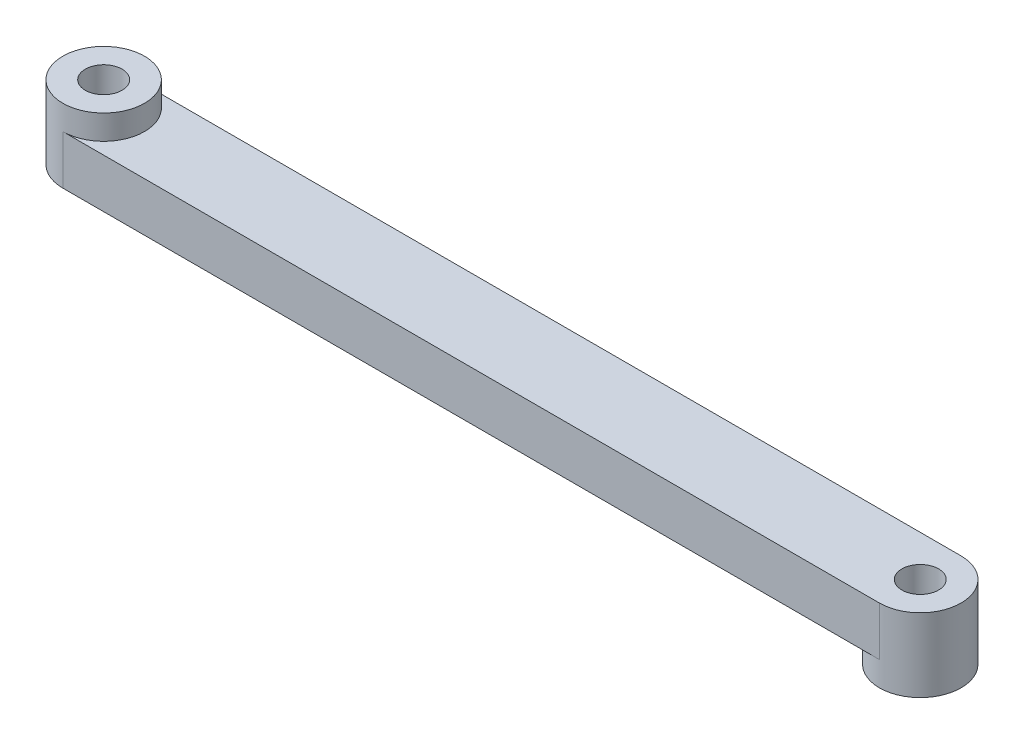
ISO-10303-21;
HEADER;
FILE_DESCRIPTION(('STEP AP214'),'2;1');
FILE_NAME('part.step','',(''),(''),'','','');
FILE_SCHEMA(('AUTOMOTIVE_DESIGN { 1 0 10303 214 1 1 1 1 }'));
ENDSEC;
DATA;
#1=APPLICATION_CONTEXT('core data for automotive mechanical design processes');
#2=APPLICATION_PROTOCOL_DEFINITION('international standard','automotive_design',2000,#1);
#3=PRODUCT_CONTEXT('',#1,'mechanical');
#4=PRODUCT('Part','Part','',(#3));
#5=PRODUCT_RELATED_PRODUCT_CATEGORY('part','',(#4));
#6=PRODUCT_DEFINITION_FORMATION('','',#4);
#7=PRODUCT_DEFINITION_CONTEXT('part definition',#1,'design');
#8=PRODUCT_DEFINITION('design','',#6,#7);
#9=PRODUCT_DEFINITION_SHAPE('','',#8);
#10=(LENGTH_UNIT() NAMED_UNIT(*) SI_UNIT(.MILLI.,.METRE.));
#11=(NAMED_UNIT(*) PLANE_ANGLE_UNIT() SI_UNIT($,.RADIAN.));
#12=(NAMED_UNIT(*) SI_UNIT($,.STERADIAN.) SOLID_ANGLE_UNIT());
#13=UNCERTAINTY_MEASURE_WITH_UNIT(LENGTH_MEASURE(1.E-05),#10,'distance_accuracy_value','');
#14=(GEOMETRIC_REPRESENTATION_CONTEXT(3) GLOBAL_UNCERTAINTY_ASSIGNED_CONTEXT((#13)) GLOBAL_UNIT_ASSIGNED_CONTEXT((#10,
#11,#12)) REPRESENTATION_CONTEXT('',''));
#15=CARTESIAN_POINT('',(0.,0.,0.));
#16=DIRECTION('',(0.,0.,1.));
#17=DIRECTION('',(1.,0.,0.));
#18=AXIS2_PLACEMENT_3D('',#15,#16,#17);
#19=CARTESIAN_POINT('',(0.,12.,5.));
#20=DIRECTION('',(0.,0.,-1.));
#21=DIRECTION('',(-1.,0.,0.));
#22=AXIS2_PLACEMENT_3D('',#19,#20,#21);
#23=PLANE('',#22);
#24=DIRECTION('',(-1.,0.,0.));
#25=VECTOR('',#24,1.);
#26=CARTESIAN_POINT('',(0.,3.,5.));
#27=LINE('',#26,#25);
#28=CARTESIAN_POINT('',(100.,3.,5.));
#29=VERTEX_POINT('',#28);
#30=CARTESIAN_POINT('',(0.,3.,5.));
#31=VERTEX_POINT('',#30);
#32=EDGE_CURVE('E62',#29,#31,#27,.T.);
#33=ORIENTED_EDGE('',*,*,#32,.F.);
#34=DIRECTION('',(0.,-1.,0.));
#35=VECTOR('',#34,1.);
#36=CARTESIAN_POINT('',(100.,12.,5.));
#37=LINE('',#36,#35);
#38=CARTESIAN_POINT('',(100.,9.,5.));
#39=VERTEX_POINT('',#38);
#40=EDGE_CURVE('E54',#39,#29,#37,.T.);
#41=ORIENTED_EDGE('',*,*,#40,.F.);
#42=DIRECTION('',(1.,0.,0.));
#43=VECTOR('',#42,1.);
#44=CARTESIAN_POINT('',(0.,9.,5.));
#45=LINE('',#44,#43);
#46=CARTESIAN_POINT('',(0.,9.,5.));
#47=VERTEX_POINT('',#46);
#48=EDGE_CURVE('E123',#47,#39,#45,.T.);
#49=ORIENTED_EDGE('',*,*,#48,.F.);
#50=DIRECTION('',(0.,-1.,0.));
#51=VECTOR('',#50,1.);
#52=CARTESIAN_POINT('',(0.,12.,5.));
#53=LINE('',#52,#51);
#54=EDGE_CURVE('E12',#47,#31,#53,.T.);
#55=ORIENTED_EDGE('',*,*,#54,.T.);
#56=EDGE_LOOP('',(#33,#41,#49,#55));
#57=FACE_BOUND('',#56,.T.);
#58=ADVANCED_FACE('F45',(#57),#23,.F.);
#59=CARTESIAN_POINT('',(0.,12.,-5.));
#60=DIRECTION('',(0.,0.,1.));
#61=DIRECTION('',(1.,0.,0.));
#62=AXIS2_PLACEMENT_3D('',#59,#60,#61);
#63=PLANE('',#62);
#64=DIRECTION('',(1.,0.,0.));
#65=VECTOR('',#64,1.);
#66=CARTESIAN_POINT('',(0.,3.,-5.));
#67=LINE('',#66,#65);
#68=CARTESIAN_POINT('',(0.,3.,-5.));
#69=VERTEX_POINT('',#68);
#70=CARTESIAN_POINT('',(100.,3.,-5.));
#71=VERTEX_POINT('',#70);
#72=EDGE_CURVE('E87',#69,#71,#67,.T.);
#73=ORIENTED_EDGE('',*,*,#72,.F.);
#74=DIRECTION('',(0.,-1.,0.));
#75=VECTOR('',#74,1.);
#76=CARTESIAN_POINT('',(0.,12.,-5.));
#77=LINE('',#76,#75);
#78=CARTESIAN_POINT('',(0.,9.,-5.));
#79=VERTEX_POINT('',#78);
#80=EDGE_CURVE('E107',#79,#69,#77,.T.);
#81=ORIENTED_EDGE('',*,*,#80,.F.);
#82=DIRECTION('',(-1.,0.,0.));
#83=VECTOR('',#82,1.);
#84=CARTESIAN_POINT('',(0.,9.,-5.));
#85=LINE('',#84,#83);
#86=CARTESIAN_POINT('',(100.,9.,-5.));
#87=VERTEX_POINT('',#86);
#88=EDGE_CURVE('E106',#87,#79,#85,.T.);
#89=ORIENTED_EDGE('',*,*,#88,.F.);
#90=DIRECTION('',(0.,-1.,0.));
#91=VECTOR('',#90,1.);
#92=CARTESIAN_POINT('',(100.,12.,-5.));
#93=LINE('',#92,#91);
#94=EDGE_CURVE('E101',#87,#71,#93,.T.);
#95=ORIENTED_EDGE('',*,*,#94,.T.);
#96=EDGE_LOOP('',(#73,#81,#89,#95));
#97=FACE_BOUND('',#96,.T.);
#98=ADVANCED_FACE('F105',(#97),#63,.F.);
#99=CARTESIAN_POINT('',(0.,0.,0.));
#100=DIRECTION('',(0.,1.,0.));
#101=DIRECTION('',(0.,0.,1.));
#102=AXIS2_PLACEMENT_3D('',#99,#100,#101);
#103=PLANE('',#102);
#104=CARTESIAN_POINT('',(100.,0.,0.));
#105=DIRECTION('',(0.,1.,0.));
#106=DIRECTION('',(0.,0.,1.));
#107=AXIS2_PLACEMENT_3D('',#104,#105,#106);
#108=CIRCLE('',#107,2.25);
#109=CARTESIAN_POINT('',(100.,0.,2.25));
#110=VERTEX_POINT('',#109);
#111=EDGE_CURVE('E125',#110,#110,#108,.T.);
#112=ORIENTED_EDGE('',*,*,#111,.T.);
#113=EDGE_LOOP('',(#112));
#114=FACE_BOUND('',#113,.T.);
#115=CARTESIAN_POINT('',(100.,0.,0.));
#116=DIRECTION('',(0.,1.,0.));
#117=DIRECTION('',(0.,0.,1.));
#118=AXIS2_PLACEMENT_3D('',#115,#116,#117);
#119=CIRCLE('',#118,5.);
#120=CARTESIAN_POINT('',(100.,0.,5.));
#121=VERTEX_POINT('',#120);
#122=EDGE_CURVE('E131',#121,#121,#119,.T.);
#123=ORIENTED_EDGE('',*,*,#122,.F.);
#124=EDGE_LOOP('',(#123));
#125=FACE_BOUND('',#124,.T.);
#126=ADVANCED_FACE('F137',(#114,#125),#103,.F.);
#127=CARTESIAN_POINT('',(0.,12.,0.));
#128=DIRECTION('',(0.,-1.,0.));
#129=DIRECTION('',(0.,0.,-1.));
#130=AXIS2_PLACEMENT_3D('',#127,#128,#129);
#131=CYLINDRICAL_SURFACE('',#130,5.);
#132=CARTESIAN_POINT('',(0.,12.,0.));
#133=DIRECTION('',(0.,1.,0.));
#134=DIRECTION('',(0.,0.,1.));
#135=AXIS2_PLACEMENT_3D('',#132,#133,#134);
#136=CIRCLE('',#135,5.);
#137=CARTESIAN_POINT('',(0.,12.,5.));
#138=VERTEX_POINT('',#137);
#139=EDGE_CURVE('E110',#138,#138,#136,.T.);
#140=ORIENTED_EDGE('',*,*,#139,.F.);
#141=EDGE_LOOP('',(#140));
#142=FACE_BOUND('',#141,.T.);
#143=CARTESIAN_POINT('',(0.,3.,0.));
#144=DIRECTION('',(0.,-1.,0.));
#145=DIRECTION('',(0.,0.,-1.));
#146=AXIS2_PLACEMENT_3D('',#143,#144,#145);
#147=CIRCLE('',#146,5.);
#148=EDGE_CURVE('E91',#31,#69,#147,.T.);
#149=ORIENTED_EDGE('',*,*,#148,.F.);
#150=ORIENTED_EDGE('',*,*,#54,.F.);
#151=CARTESIAN_POINT('',(0.,9.,0.));
#152=DIRECTION('',(0.,1.,0.));
#153=DIRECTION('',(0.,0.,1.));
#154=AXIS2_PLACEMENT_3D('',#151,#152,#153);
#155=CIRCLE('',#154,5.);
#156=EDGE_CURVE('E70',#47,#79,#155,.T.);
#157=ORIENTED_EDGE('',*,*,#156,.T.);
#158=ORIENTED_EDGE('',*,*,#80,.T.);
#159=EDGE_LOOP('',(#149,#150,#157,#158));
#160=FACE_BOUND('',#159,.T.);
#161=ADVANCED_FACE('F47',(#142,#160),#131,.T.);
#162=CARTESIAN_POINT('',(0.,12.,0.));
#163=DIRECTION('',(0.,-1.,0.));
#164=DIRECTION('',(0.,0.,-1.));
#165=AXIS2_PLACEMENT_3D('',#162,#163,#164);
#166=CYLINDRICAL_SURFACE('',#165,2.25);
#167=CARTESIAN_POINT('',(0.,12.,0.));
#168=DIRECTION('',(0.,1.,0.));
#169=DIRECTION('',(0.,0.,1.));
#170=AXIS2_PLACEMENT_3D('',#167,#168,#169);
#171=CIRCLE('',#170,2.25);
#172=CARTESIAN_POINT('',(0.,12.,2.25));
#173=VERTEX_POINT('',#172);
#174=EDGE_CURVE('E128',#173,#173,#171,.T.);
#175=ORIENTED_EDGE('',*,*,#174,.T.);
#176=EDGE_LOOP('',(#175));
#177=FACE_BOUND('',#176,.T.);
#178=CARTESIAN_POINT('',(0.,3.,0.));
#179=DIRECTION('',(0.,-1.,0.));
#180=DIRECTION('',(0.,0.,-1.));
#181=AXIS2_PLACEMENT_3D('',#178,#179,#180);
#182=CIRCLE('',#181,2.25);
#183=CARTESIAN_POINT('',(0.,3.,-2.25));
#184=VERTEX_POINT('',#183);
#185=EDGE_CURVE('E49',#184,#184,#182,.T.);
#186=ORIENTED_EDGE('',*,*,#185,.T.);
#187=EDGE_LOOP('',(#186));
#188=FACE_BOUND('',#187,.T.);
#189=ADVANCED_FACE('F145',(#177,#188),#166,.F.);
#190=CARTESIAN_POINT('',(0.,12.,0.));
#191=DIRECTION('',(0.,1.,0.));
#192=DIRECTION('',(0.,0.,1.));
#193=AXIS2_PLACEMENT_3D('',#190,#191,#192);
#194=PLANE('',#193);
#195=ORIENTED_EDGE('',*,*,#174,.F.);
#196=EDGE_LOOP('',(#195));
#197=FACE_BOUND('',#196,.T.);
#198=ORIENTED_EDGE('',*,*,#139,.T.);
#199=EDGE_LOOP('',(#198));
#200=FACE_BOUND('',#199,.T.);
#201=ADVANCED_FACE('F156',(#197,#200),#194,.T.);
#202=CARTESIAN_POINT('',(100.,12.,0.));
#203=DIRECTION('',(0.,-1.,0.));
#204=DIRECTION('',(0.,0.,-1.));
#205=AXIS2_PLACEMENT_3D('',#202,#203,#204);
#206=CYLINDRICAL_SURFACE('',#205,5.);
#207=ORIENTED_EDGE('',*,*,#122,.T.);
#208=EDGE_LOOP('',(#207));
#209=FACE_BOUND('',#208,.T.);
#210=ORIENTED_EDGE('',*,*,#40,.T.);
#211=CARTESIAN_POINT('',(100.,3.,0.));
#212=DIRECTION('',(0.,-1.,0.));
#213=DIRECTION('',(0.,0.,-1.));
#214=AXIS2_PLACEMENT_3D('',#211,#212,#213);
#215=CIRCLE('',#214,5.);
#216=EDGE_CURVE('E90',#29,#71,#215,.T.);
#217=ORIENTED_EDGE('',*,*,#216,.T.);
#218=ORIENTED_EDGE('',*,*,#94,.F.);
#219=CARTESIAN_POINT('',(100.,9.,0.));
#220=DIRECTION('',(0.,1.,0.));
#221=DIRECTION('',(0.,0.,1.));
#222=AXIS2_PLACEMENT_3D('',#219,#220,#221);
#223=CIRCLE('',#222,5.);
#224=EDGE_CURVE('E117',#39,#87,#223,.T.);
#225=ORIENTED_EDGE('',*,*,#224,.F.);
#226=EDGE_LOOP('',(#210,#217,#218,#225));
#227=FACE_BOUND('',#226,.T.);
#228=ADVANCED_FACE('F99',(#209,#227),#206,.T.);
#229=CARTESIAN_POINT('',(100.,12.,0.));
#230=DIRECTION('',(0.,-1.,0.));
#231=DIRECTION('',(0.,0.,-1.));
#232=AXIS2_PLACEMENT_3D('',#229,#230,#231);
#233=CYLINDRICAL_SURFACE('',#232,2.25);
#234=ORIENTED_EDGE('',*,*,#111,.F.);
#235=EDGE_LOOP('',(#234));
#236=FACE_BOUND('',#235,.T.);
#237=CARTESIAN_POINT('',(100.,9.,0.));
#238=DIRECTION('',(0.,1.,0.));
#239=DIRECTION('',(0.,0.,1.));
#240=AXIS2_PLACEMENT_3D('',#237,#238,#239);
#241=CIRCLE('',#240,2.25);
#242=CARTESIAN_POINT('',(100.,9.,2.25));
#243=VERTEX_POINT('',#242);
#244=EDGE_CURVE('E113',#243,#243,#241,.T.);
#245=ORIENTED_EDGE('',*,*,#244,.T.);
#246=EDGE_LOOP('',(#245));
#247=FACE_BOUND('',#246,.T.);
#248=ADVANCED_FACE('F155',(#236,#247),#233,.F.);
#249=CARTESIAN_POINT('',(0.,9.,0.));
#250=DIRECTION('',(0.,1.,0.));
#251=DIRECTION('',(0.,0.,1.));
#252=AXIS2_PLACEMENT_3D('',#249,#250,#251);
#253=PLANE('',#252);
#254=ORIENTED_EDGE('',*,*,#244,.F.);
#255=EDGE_LOOP('',(#254));
#256=FACE_BOUND('',#255,.T.);
#257=ORIENTED_EDGE('',*,*,#48,.T.);
#258=ORIENTED_EDGE('',*,*,#224,.T.);
#259=ORIENTED_EDGE('',*,*,#88,.T.);
#260=ORIENTED_EDGE('',*,*,#156,.F.);
#261=EDGE_LOOP('',(#257,#258,#259,#260));
#262=FACE_BOUND('',#261,.T.);
#263=ADVANCED_FACE('F161',(#256,#262),#253,.T.);
#264=CARTESIAN_POINT('',(100.,3.,0.));
#265=DIRECTION('',(0.,-1.,0.));
#266=DIRECTION('',(0.,0.,-1.));
#267=AXIS2_PLACEMENT_3D('',#264,#265,#266);
#268=PLANE('',#267);
#269=ORIENTED_EDGE('',*,*,#185,.F.);
#270=EDGE_LOOP('',(#269));
#271=FACE_BOUND('',#270,.T.);
#272=ORIENTED_EDGE('',*,*,#32,.T.);
#273=ORIENTED_EDGE('',*,*,#148,.T.);
#274=ORIENTED_EDGE('',*,*,#72,.T.);
#275=ORIENTED_EDGE('',*,*,#216,.F.);
#276=EDGE_LOOP('',(#272,#273,#274,#275));
#277=FACE_BOUND('',#276,.T.);
#278=ADVANCED_FACE('F89',(#271,#277),#268,.T.);
#279=CLOSED_SHELL('',(#58,#98,#126,#161,#189,#201,#228,#248,#263,#278));
#280=MANIFOLD_SOLID_BREP('B2',#279);
#281=ADVANCED_BREP_SHAPE_REPRESENTATION('',(#18,#280),#14);
#282=SHAPE_DEFINITION_REPRESENTATION(#9,#281);
ENDSEC;
END-ISO-10303-21;
